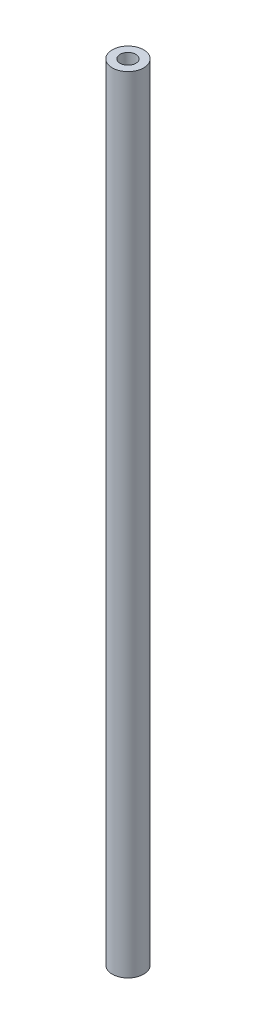
ISO-10303-21;
HEADER;
FILE_DESCRIPTION(('STEP AP214'),'2;1');
FILE_NAME('part.step','',(''),(''),'','','');
FILE_SCHEMA(('AUTOMOTIVE_DESIGN { 1 0 10303 214 1 1 1 1 }'));
ENDSEC;
DATA;
#1=APPLICATION_CONTEXT('core data for automotive mechanical design processes');
#2=APPLICATION_PROTOCOL_DEFINITION('international standard','automotive_design',2000,#1);
#3=PRODUCT_CONTEXT('',#1,'mechanical');
#4=PRODUCT('Part','Part','',(#3));
#5=PRODUCT_RELATED_PRODUCT_CATEGORY('part','',(#4));
#6=PRODUCT_DEFINITION_FORMATION('','',#4);
#7=PRODUCT_DEFINITION_CONTEXT('part definition',#1,'design');
#8=PRODUCT_DEFINITION('design','',#6,#7);
#9=PRODUCT_DEFINITION_SHAPE('','',#8);
#10=(LENGTH_UNIT() NAMED_UNIT(*) SI_UNIT(.MILLI.,.METRE.));
#11=(NAMED_UNIT(*) PLANE_ANGLE_UNIT() SI_UNIT($,.RADIAN.));
#12=(NAMED_UNIT(*) SI_UNIT($,.STERADIAN.) SOLID_ANGLE_UNIT());
#13=UNCERTAINTY_MEASURE_WITH_UNIT(LENGTH_MEASURE(1.E-05),#10,'distance_accuracy_value','');
#14=(GEOMETRIC_REPRESENTATION_CONTEXT(3) GLOBAL_UNCERTAINTY_ASSIGNED_CONTEXT((#13)) GLOBAL_UNIT_ASSIGNED_CONTEXT((#10,
#11,#12)) REPRESENTATION_CONTEXT('',''));
#15=CARTESIAN_POINT('',(0.,0.,0.));
#16=DIRECTION('',(0.,0.,1.));
#17=DIRECTION('',(1.,0.,0.));
#18=AXIS2_PLACEMENT_3D('',#15,#16,#17);
#19=CARTESIAN_POINT('',(0.,200.,0.));
#20=DIRECTION('',(0.,-1.,0.));
#21=DIRECTION('',(0.,0.,-1.));
#22=AXIS2_PLACEMENT_3D('',#19,#20,#21);
#23=CYLINDRICAL_SURFACE('',#22,4.);
#24=CARTESIAN_POINT('',(0.,200.,0.));
#25=DIRECTION('',(0.,1.,0.));
#26=DIRECTION('',(0.,0.,1.));
#27=AXIS2_PLACEMENT_3D('',#24,#25,#26);
#28=CIRCLE('',#27,4.);
#29=CARTESIAN_POINT('',(0.,200.,4.));
#30=VERTEX_POINT('',#29);
#31=EDGE_CURVE('E10',#30,#30,#28,.T.);
#32=ORIENTED_EDGE('',*,*,#31,.F.);
#33=EDGE_LOOP('',(#32));
#34=FACE_BOUND('',#33,.T.);
#35=CARTESIAN_POINT('',(0.,0.,0.));
#36=DIRECTION('',(0.,1.,0.));
#37=DIRECTION('',(0.,0.,1.));
#38=AXIS2_PLACEMENT_3D('',#35,#36,#37);
#39=CIRCLE('',#38,4.);
#40=CARTESIAN_POINT('',(0.,0.,4.));
#41=VERTEX_POINT('',#40);
#42=EDGE_CURVE('E35',#41,#41,#39,.T.);
#43=ORIENTED_EDGE('',*,*,#42,.T.);
#44=EDGE_LOOP('',(#43));
#45=FACE_BOUND('',#44,.T.);
#46=ADVANCED_FACE('F32',(#34,#45),#23,.T.);
#47=CARTESIAN_POINT('',(0.,200.,0.));
#48=DIRECTION('',(0.,1.,0.));
#49=DIRECTION('',(0.,0.,1.));
#50=AXIS2_PLACEMENT_3D('',#47,#48,#49);
#51=PLANE('',#50);
#52=CARTESIAN_POINT('',(0.,200.,0.));
#53=DIRECTION('',(0.,1.,0.));
#54=DIRECTION('',(0.,0.,1.));
#55=AXIS2_PLACEMENT_3D('',#52,#53,#54);
#56=CIRCLE('',#55,2.);
#57=CARTESIAN_POINT('',(0.,200.,2.));
#58=VERTEX_POINT('',#57);
#59=EDGE_CURVE('E44',#58,#58,#56,.T.);
#60=ORIENTED_EDGE('',*,*,#59,.F.);
#61=EDGE_LOOP('',(#60));
#62=FACE_BOUND('',#61,.T.);
#63=ORIENTED_EDGE('',*,*,#31,.T.);
#64=EDGE_LOOP('',(#63));
#65=FACE_BOUND('',#64,.T.);
#66=ADVANCED_FACE('F59',(#62,#65),#51,.T.);
#67=CARTESIAN_POINT('',(0.,0.,0.));
#68=DIRECTION('',(0.,1.,0.));
#69=DIRECTION('',(0.,0.,1.));
#70=AXIS2_PLACEMENT_3D('',#67,#68,#69);
#71=PLANE('',#70);
#72=CARTESIAN_POINT('',(0.,0.,0.));
#73=DIRECTION('',(0.,1.,0.));
#74=DIRECTION('',(0.,0.,1.));
#75=AXIS2_PLACEMENT_3D('',#72,#73,#74);
#76=CIRCLE('',#75,2.);
#77=CARTESIAN_POINT('',(0.,0.,2.));
#78=VERTEX_POINT('',#77);
#79=EDGE_CURVE('E42',#78,#78,#76,.T.);
#80=ORIENTED_EDGE('',*,*,#79,.T.);
#81=EDGE_LOOP('',(#80));
#82=FACE_BOUND('',#81,.T.);
#83=ORIENTED_EDGE('',*,*,#42,.F.);
#84=EDGE_LOOP('',(#83));
#85=FACE_BOUND('',#84,.T.);
#86=ADVANCED_FACE('F50',(#82,#85),#71,.F.);
#87=CARTESIAN_POINT('',(0.,0.,0.));
#88=DIRECTION('',(0.,1.,0.));
#89=DIRECTION('',(0.,0.,1.));
#90=AXIS2_PLACEMENT_3D('',#87,#88,#89);
#91=CYLINDRICAL_SURFACE('',#90,2.);
#92=ORIENTED_EDGE('',*,*,#79,.F.);
#93=EDGE_LOOP('',(#92));
#94=FACE_BOUND('',#93,.T.);
#95=ORIENTED_EDGE('',*,*,#59,.T.);
#96=EDGE_LOOP('',(#95));
#97=FACE_BOUND('',#96,.T.);
#98=ADVANCED_FACE('F53',(#94,#97),#91,.F.);
#99=CLOSED_SHELL('',(#46,#66,#86,#98));
#100=MANIFOLD_SOLID_BREP('B2',#99);
#101=ADVANCED_BREP_SHAPE_REPRESENTATION('',(#18,#100),#14);
#102=SHAPE_DEFINITION_REPRESENTATION(#9,#101);
ENDSEC;
END-ISO-10303-21;
